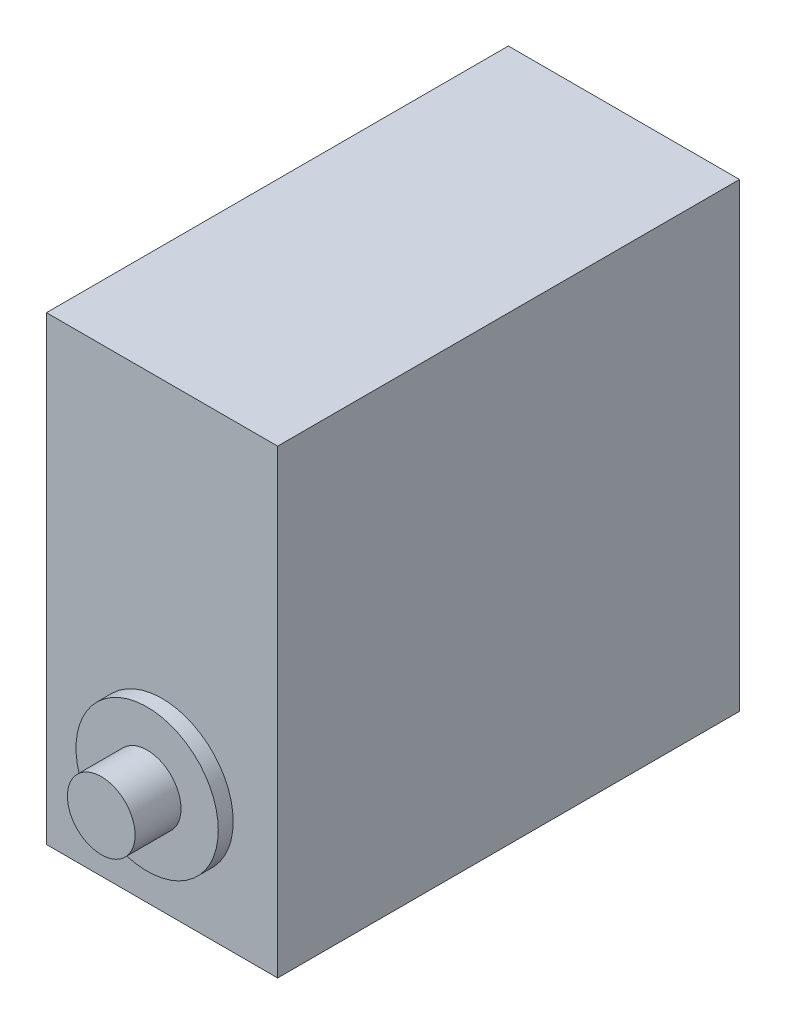
ISO-10303-21;
HEADER;
FILE_DESCRIPTION(('STEP AP214'),'2;1');
FILE_NAME('part.step','',(''),(''),'','','');
FILE_SCHEMA(('AUTOMOTIVE_DESIGN { 1 0 10303 214 1 1 1 1 }'));
ENDSEC;
DATA;
#1=APPLICATION_CONTEXT('core data for automotive mechanical design processes');
#2=APPLICATION_PROTOCOL_DEFINITION('international standard','automotive_design',2000,#1);
#3=PRODUCT_CONTEXT('',#1,'mechanical');
#4=PRODUCT('Part','Part','',(#3));
#5=PRODUCT_RELATED_PRODUCT_CATEGORY('part','',(#4));
#6=PRODUCT_DEFINITION_FORMATION('','',#4);
#7=PRODUCT_DEFINITION_CONTEXT('part definition',#1,'design');
#8=PRODUCT_DEFINITION('design','',#6,#7);
#9=PRODUCT_DEFINITION_SHAPE('','',#8);
#10=(LENGTH_UNIT() NAMED_UNIT(*) SI_UNIT(.MILLI.,.METRE.));
#11=(NAMED_UNIT(*) PLANE_ANGLE_UNIT() SI_UNIT($,.RADIAN.));
#12=(NAMED_UNIT(*) SI_UNIT($,.STERADIAN.) SOLID_ANGLE_UNIT());
#13=UNCERTAINTY_MEASURE_WITH_UNIT(LENGTH_MEASURE(1.E-05),#10,'distance_accuracy_value','');
#14=(GEOMETRIC_REPRESENTATION_CONTEXT(3) GLOBAL_UNCERTAINTY_ASSIGNED_CONTEXT((#13)) GLOBAL_UNIT_ASSIGNED_CONTEXT((#10,
#11,#12)) REPRESENTATION_CONTEXT('',''));
#15=CARTESIAN_POINT('',(0.,0.,0.));
#16=DIRECTION('',(0.,0.,1.));
#17=DIRECTION('',(1.,0.,0.));
#18=AXIS2_PLACEMENT_3D('',#15,#16,#17);
#19=CARTESIAN_POINT('',(10.075,20.0750000000001,20.13));
#20=DIRECTION('',(0.,-1.,0.));
#21=DIRECTION('',(0.,0.,-1.));
#22=AXIS2_PLACEMENT_3D('',#19,#20,#21);
#23=PLANE('',#22);
#24=DIRECTION('',(-1.,0.,0.));
#25=VECTOR('',#24,1.);
#26=CARTESIAN_POINT('',(10.075,20.0750000000001,-20.13));
#27=LINE('',#26,#25);
#28=CARTESIAN_POINT('',(10.075,20.0750000000001,-20.13));
#29=VERTEX_POINT('',#28);
#30=CARTESIAN_POINT('',(-10.075,20.0750000000001,-20.13));
#31=VERTEX_POINT('',#30);
#32=EDGE_CURVE('E166',#29,#31,#27,.T.);
#33=ORIENTED_EDGE('',*,*,#32,.T.);
#34=DIRECTION('',(0.,0.,-1.));
#35=VECTOR('',#34,1.);
#36=CARTESIAN_POINT('',(-10.075,20.0750000000001,20.13));
#37=LINE('',#36,#35);
#38=CARTESIAN_POINT('',(-10.075,20.0750000000001,20.13));
#39=VERTEX_POINT('',#38);
#40=EDGE_CURVE('E97',#39,#31,#37,.T.);
#41=ORIENTED_EDGE('',*,*,#40,.F.);
#42=DIRECTION('',(-1.,0.,0.));
#43=VECTOR('',#42,1.);
#44=CARTESIAN_POINT('',(10.075,20.0750000000001,20.13));
#45=LINE('',#44,#43);
#46=CARTESIAN_POINT('',(10.075,20.0750000000001,20.13));
#47=VERTEX_POINT('',#46);
#48=EDGE_CURVE('E151',#47,#39,#45,.T.);
#49=ORIENTED_EDGE('',*,*,#48,.F.);
#50=DIRECTION('',(0.,0.,-1.));
#51=VECTOR('',#50,1.);
#52=CARTESIAN_POINT('',(10.075,20.0750000000001,20.13));
#53=LINE('',#52,#51);
#54=EDGE_CURVE('E164',#47,#29,#53,.T.);
#55=ORIENTED_EDGE('',*,*,#54,.T.);
#56=EDGE_LOOP('',(#33,#41,#49,#55));
#57=FACE_BOUND('',#56,.T.);
#58=ADVANCED_FACE('F96',(#57),#23,.F.);
#59=CARTESIAN_POINT('',(-10.075,-20.0749999999999,20.13));
#60=DIRECTION('',(1.,0.,0.));
#61=DIRECTION('',(0.,0.,-1.));
#62=AXIS2_PLACEMENT_3D('',#59,#60,#61);
#63=PLANE('',#62);
#64=DIRECTION('',(0.,-1.,0.));
#65=VECTOR('',#64,1.);
#66=CARTESIAN_POINT('',(-10.075,-20.0749999999999,-20.13));
#67=LINE('',#66,#65);
#68=CARTESIAN_POINT('',(-10.075,-20.0749999999999,-20.13));
#69=VERTEX_POINT('',#68);
#70=EDGE_CURVE('E160',#31,#69,#67,.T.);
#71=ORIENTED_EDGE('',*,*,#70,.T.);
#72=DIRECTION('',(0.,0.,-1.));
#73=VECTOR('',#72,1.);
#74=CARTESIAN_POINT('',(-10.075,-20.0749999999999,20.13));
#75=LINE('',#74,#73);
#76=CARTESIAN_POINT('',(-10.075,-20.0749999999999,20.13));
#77=VERTEX_POINT('',#76);
#78=EDGE_CURVE('E154',#77,#69,#75,.T.);
#79=ORIENTED_EDGE('',*,*,#78,.F.);
#80=DIRECTION('',(0.,-1.,0.));
#81=VECTOR('',#80,1.);
#82=CARTESIAN_POINT('',(-10.075,-20.0749999999999,20.13));
#83=LINE('',#82,#81);
#84=EDGE_CURVE('E148',#39,#77,#83,.T.);
#85=ORIENTED_EDGE('',*,*,#84,.F.);
#86=ORIENTED_EDGE('',*,*,#40,.T.);
#87=EDGE_LOOP('',(#71,#79,#85,#86));
#88=FACE_BOUND('',#87,.T.);
#89=ADVANCED_FACE('F156',(#88),#63,.F.);
#90=CARTESIAN_POINT('',(10.075,-20.0749999999999,20.13));
#91=DIRECTION('',(0.,1.,0.));
#92=DIRECTION('',(0.,0.,1.));
#93=AXIS2_PLACEMENT_3D('',#90,#91,#92);
#94=PLANE('',#93);
#95=DIRECTION('',(1.,0.,0.));
#96=VECTOR('',#95,1.);
#97=CARTESIAN_POINT('',(10.075,-20.0749999999999,-20.13));
#98=LINE('',#97,#96);
#99=CARTESIAN_POINT('',(10.075,-20.0749999999999,-20.13));
#100=VERTEX_POINT('',#99);
#101=EDGE_CURVE('E135',#69,#100,#98,.T.);
#102=ORIENTED_EDGE('',*,*,#101,.T.);
#103=DIRECTION('',(0.,0.,-1.));
#104=VECTOR('',#103,1.);
#105=CARTESIAN_POINT('',(10.075,-20.0749999999999,20.13));
#106=LINE('',#105,#104);
#107=CARTESIAN_POINT('',(10.075,-20.0749999999999,20.13));
#108=VERTEX_POINT('',#107);
#109=EDGE_CURVE('E157',#108,#100,#106,.T.);
#110=ORIENTED_EDGE('',*,*,#109,.F.);
#111=DIRECTION('',(1.,0.,0.));
#112=VECTOR('',#111,1.);
#113=CARTESIAN_POINT('',(10.075,-20.0749999999999,20.13));
#114=LINE('',#113,#112);
#115=EDGE_CURVE('E149',#77,#108,#114,.T.);
#116=ORIENTED_EDGE('',*,*,#115,.F.);
#117=ORIENTED_EDGE('',*,*,#78,.T.);
#118=EDGE_LOOP('',(#102,#110,#116,#117));
#119=FACE_BOUND('',#118,.T.);
#120=ADVANCED_FACE('F159',(#119),#94,.F.);
#121=CARTESIAN_POINT('',(10.075,-20.0749999999999,20.13));
#122=DIRECTION('',(-1.,0.,0.));
#123=DIRECTION('',(0.,0.,1.));
#124=AXIS2_PLACEMENT_3D('',#121,#122,#123);
#125=PLANE('',#124);
#126=DIRECTION('',(0.,1.,0.));
#127=VECTOR('',#126,1.);
#128=CARTESIAN_POINT('',(10.075,-20.0749999999999,-20.13));
#129=LINE('',#128,#127);
#130=EDGE_CURVE('E138',#100,#29,#129,.T.);
#131=ORIENTED_EDGE('',*,*,#130,.T.);
#132=ORIENTED_EDGE('',*,*,#54,.F.);
#133=DIRECTION('',(0.,1.,0.));
#134=VECTOR('',#133,1.);
#135=CARTESIAN_POINT('',(10.075,-20.0749999999999,20.13));
#136=LINE('',#135,#134);
#137=EDGE_CURVE('E113',#108,#47,#136,.T.);
#138=ORIENTED_EDGE('',*,*,#137,.F.);
#139=ORIENTED_EDGE('',*,*,#109,.T.);
#140=EDGE_LOOP('',(#131,#132,#138,#139));
#141=FACE_BOUND('',#140,.T.);
#142=ADVANCED_FACE('F184',(#141),#125,.F.);
#143=CARTESIAN_POINT('',(0.,0.,20.13));
#144=DIRECTION('',(0.,0.,-1.));
#145=DIRECTION('',(-1.,0.,0.));
#146=AXIS2_PLACEMENT_3D('',#143,#144,#145);
#147=PLANE('',#146);
#148=CARTESIAN_POINT('',(0.,-10.2049999999999,20.13));
#149=DIRECTION('',(0.,0.,1.));
#150=DIRECTION('',(1.,0.,0.));
#151=AXIS2_PLACEMENT_3D('',#148,#149,#150);
#152=CIRCLE('',#151,6.20000000000001);
#153=CARTESIAN_POINT('',(6.20000000000001,-10.2049999999999,20.13));
#154=VERTEX_POINT('',#153);
#155=EDGE_CURVE('E195',#154,#154,#152,.T.);
#156=ORIENTED_EDGE('',*,*,#155,.F.);
#157=EDGE_LOOP('',(#156));
#158=FACE_BOUND('',#157,.T.);
#159=ORIENTED_EDGE('',*,*,#48,.T.);
#160=ORIENTED_EDGE('',*,*,#84,.T.);
#161=ORIENTED_EDGE('',*,*,#115,.T.);
#162=ORIENTED_EDGE('',*,*,#137,.T.);
#163=EDGE_LOOP('',(#159,#160,#161,#162));
#164=FACE_BOUND('',#163,.T.);
#165=ADVANCED_FACE('F150',(#158,#164),#147,.F.);
#166=CARTESIAN_POINT('',(0.,0.,-20.13));
#167=DIRECTION('',(0.,0.,-1.));
#168=DIRECTION('',(-1.,0.,0.));
#169=AXIS2_PLACEMENT_3D('',#166,#167,#168);
#170=PLANE('',#169);
#171=CARTESIAN_POINT('',(0.,-10.2049999999999,-20.13));
#172=DIRECTION('',(0.,0.,1.));
#173=DIRECTION('',(1.,0.,0.));
#174=AXIS2_PLACEMENT_3D('',#171,#172,#173);
#175=CIRCLE('',#174,6.20000000000001);
#176=CARTESIAN_POINT('',(6.20000000000001,-10.2049999999999,-20.13));
#177=VERTEX_POINT('',#176);
#178=EDGE_CURVE('E199',#177,#177,#175,.T.);
#179=ORIENTED_EDGE('',*,*,#178,.T.);
#180=EDGE_LOOP('',(#179));
#181=FACE_BOUND('',#180,.T.);
#182=ORIENTED_EDGE('',*,*,#32,.F.);
#183=ORIENTED_EDGE('',*,*,#130,.F.);
#184=ORIENTED_EDGE('',*,*,#101,.F.);
#185=ORIENTED_EDGE('',*,*,#70,.F.);
#186=EDGE_LOOP('',(#182,#183,#184,#185));
#187=FACE_BOUND('',#186,.T.);
#188=ADVANCED_FACE('F190',(#181,#187),#170,.T.);
#189=CARTESIAN_POINT('',(0.,-10.2049999999999,21.43));
#190=DIRECTION('',(0.,0.,-1.));
#191=DIRECTION('',(-1.,0.,0.));
#192=AXIS2_PLACEMENT_3D('',#189,#190,#191);
#193=CYLINDRICAL_SURFACE('',#192,6.20000000000001);
#194=CARTESIAN_POINT('',(0.,-10.2049999999999,21.43));
#195=DIRECTION('',(0.,0.,1.));
#196=DIRECTION('',(1.,0.,0.));
#197=AXIS2_PLACEMENT_3D('',#194,#195,#196);
#198=CIRCLE('',#197,6.20000000000001);
#199=CARTESIAN_POINT('',(6.20000000000001,-10.2049999999999,21.43));
#200=VERTEX_POINT('',#199);
#201=EDGE_CURVE('E171',#200,#200,#198,.T.);
#202=ORIENTED_EDGE('',*,*,#201,.F.);
#203=EDGE_LOOP('',(#202));
#204=FACE_BOUND('',#203,.T.);
#205=ORIENTED_EDGE('',*,*,#155,.T.);
#206=EDGE_LOOP('',(#205));
#207=FACE_BOUND('',#206,.T.);
#208=ADVANCED_FACE('F233',(#204,#207),#193,.T.);
#209=CARTESIAN_POINT('',(0.,-10.2049999999999,21.43));
#210=DIRECTION('',(0.,0.,1.));
#211=DIRECTION('',(1.,0.,0.));
#212=AXIS2_PLACEMENT_3D('',#209,#210,#211);
#213=PLANE('',#212);
#214=CARTESIAN_POINT('',(0.,-10.2049999999999,21.43));
#215=DIRECTION('',(0.,0.,1.));
#216=DIRECTION('',(1.,0.,0.));
#217=AXIS2_PLACEMENT_3D('',#214,#215,#216);
#218=CIRCLE('',#217,2.95);
#219=CARTESIAN_POINT('',(2.95,-10.2049999999999,21.43));
#220=VERTEX_POINT('',#219);
#221=EDGE_CURVE('E14',#220,#220,#218,.T.);
#222=ORIENTED_EDGE('',*,*,#221,.F.);
#223=EDGE_LOOP('',(#222));
#224=FACE_BOUND('',#223,.T.);
#225=ORIENTED_EDGE('',*,*,#201,.T.);
#226=EDGE_LOOP('',(#225));
#227=FACE_BOUND('',#226,.T.);
#228=ADVANCED_FACE('F229',(#224,#227),#213,.T.);
#229=CARTESIAN_POINT('',(0.,-10.2049999999999,-21.43));
#230=DIRECTION('',(0.,0.,1.));
#231=DIRECTION('',(1.,0.,0.));
#232=AXIS2_PLACEMENT_3D('',#229,#230,#231);
#233=CYLINDRICAL_SURFACE('',#232,6.20000000000001);
#234=CARTESIAN_POINT('',(0.,-10.2049999999999,-21.43));
#235=DIRECTION('',(0.,0.,1.));
#236=DIRECTION('',(1.,0.,0.));
#237=AXIS2_PLACEMENT_3D('',#234,#235,#236);
#238=CIRCLE('',#237,6.20000000000001);
#239=CARTESIAN_POINT('',(6.20000000000001,-10.2049999999999,-21.43));
#240=VERTEX_POINT('',#239);
#241=EDGE_CURVE('E200',#240,#240,#238,.T.);
#242=ORIENTED_EDGE('',*,*,#241,.T.);
#243=EDGE_LOOP('',(#242));
#244=FACE_BOUND('',#243,.T.);
#245=ORIENTED_EDGE('',*,*,#178,.F.);
#246=EDGE_LOOP('',(#245));
#247=FACE_BOUND('',#246,.T.);
#248=ADVANCED_FACE('F235',(#244,#247),#233,.T.);
#249=CARTESIAN_POINT('',(0.,-10.2049999999999,-21.43));
#250=DIRECTION('',(0.,0.,-1.));
#251=DIRECTION('',(1.,0.,0.));
#252=AXIS2_PLACEMENT_3D('',#249,#250,#251);
#253=PLANE('',#252);
#254=CARTESIAN_POINT('',(0.,-10.2049999999999,-21.43));
#255=DIRECTION('',(0.,0.,-1.));
#256=DIRECTION('',(-1.,0.,0.));
#257=AXIS2_PLACEMENT_3D('',#254,#255,#256);
#258=CIRCLE('',#257,3.);
#259=CARTESIAN_POINT('',(-3.,-10.2049999999999,-21.43));
#260=VERTEX_POINT('',#259);
#261=EDGE_CURVE('E106',#260,#260,#258,.T.);
#262=ORIENTED_EDGE('',*,*,#261,.F.);
#263=EDGE_LOOP('',(#262));
#264=FACE_BOUND('',#263,.T.);
#265=ORIENTED_EDGE('',*,*,#241,.F.);
#266=EDGE_LOOP('',(#265));
#267=FACE_BOUND('',#266,.T.);
#268=ADVANCED_FACE('F299',(#264,#267),#253,.T.);
#269=CARTESIAN_POINT('',(0.,-10.2049999999999,-25.43));
#270=DIRECTION('',(0.,0.,1.));
#271=DIRECTION('',(1.,0.,0.));
#272=AXIS2_PLACEMENT_3D('',#269,#270,#271);
#273=CYLINDRICAL_SURFACE('',#272,3.);
#274=CARTESIAN_POINT('',(0.,-10.2049999999999,-25.43));
#275=DIRECTION('',(0.,0.,-1.));
#276=DIRECTION('',(-1.,0.,0.));
#277=AXIS2_PLACEMENT_3D('',#274,#275,#276);
#278=CIRCLE('',#277,3.);
#279=CARTESIAN_POINT('',(-3.,-10.2049999999999,-25.43));
#280=VERTEX_POINT('',#279);
#281=EDGE_CURVE('E204',#280,#280,#278,.T.);
#282=ORIENTED_EDGE('',*,*,#281,.F.);
#283=EDGE_LOOP('',(#282));
#284=FACE_BOUND('',#283,.T.);
#285=ORIENTED_EDGE('',*,*,#261,.T.);
#286=EDGE_LOOP('',(#285));
#287=FACE_BOUND('',#286,.T.);
#288=ADVANCED_FACE('F310',(#284,#287),#273,.T.);
#289=CARTESIAN_POINT('',(0.,-10.2049999999999,-25.43));
#290=DIRECTION('',(0.,0.,-1.));
#291=DIRECTION('',(-1.,0.,0.));
#292=AXIS2_PLACEMENT_3D('',#289,#290,#291);
#293=PLANE('',#292);
#294=ORIENTED_EDGE('',*,*,#281,.T.);
#295=EDGE_LOOP('',(#294));
#296=FACE_BOUND('',#295,.T.);
#297=ADVANCED_FACE('F223',(#296),#293,.T.);
#298=CARTESIAN_POINT('',(0.,-10.2049999999999,25.43));
#299=DIRECTION('',(0.,0.,-1.));
#300=DIRECTION('',(-1.,0.,0.));
#301=AXIS2_PLACEMENT_3D('',#298,#299,#300);
#302=CYLINDRICAL_SURFACE('',#301,2.95);
#303=CARTESIAN_POINT('',(0.,-10.2049999999999,25.43));
#304=DIRECTION('',(0.,0.,1.));
#305=DIRECTION('',(1.,0.,0.));
#306=AXIS2_PLACEMENT_3D('',#303,#304,#305);
#307=CIRCLE('',#306,2.95);
#308=CARTESIAN_POINT('',(2.95,-10.2049999999999,25.43));
#309=VERTEX_POINT('',#308);
#310=EDGE_CURVE('E213',#309,#309,#307,.T.);
#311=ORIENTED_EDGE('',*,*,#310,.F.);
#312=EDGE_LOOP('',(#311));
#313=FACE_BOUND('',#312,.T.);
#314=ORIENTED_EDGE('',*,*,#221,.T.);
#315=EDGE_LOOP('',(#314));
#316=FACE_BOUND('',#315,.T.);
#317=ADVANCED_FACE('F225',(#313,#316),#302,.T.);
#318=CARTESIAN_POINT('',(0.,-10.2049999999999,25.43));
#319=DIRECTION('',(0.,0.,1.));
#320=DIRECTION('',(1.,0.,0.));
#321=AXIS2_PLACEMENT_3D('',#318,#319,#320);
#322=PLANE('',#321);
#323=ORIENTED_EDGE('',*,*,#310,.T.);
#324=EDGE_LOOP('',(#323));
#325=FACE_BOUND('',#324,.T.);
#326=ADVANCED_FACE('F219',(#325),#322,.T.);
#327=CLOSED_SHELL('',(#58,#89,#120,#142,#165,#188,#208,#228,#248,#268,#288,#297,#317,#326));
#328=MANIFOLD_SOLID_BREP('B2',#327);
#329=ADVANCED_BREP_SHAPE_REPRESENTATION('',(#18,#328),#14);
#330=SHAPE_DEFINITION_REPRESENTATION(#9,#329);
ENDSEC;
END-ISO-10303-21;
